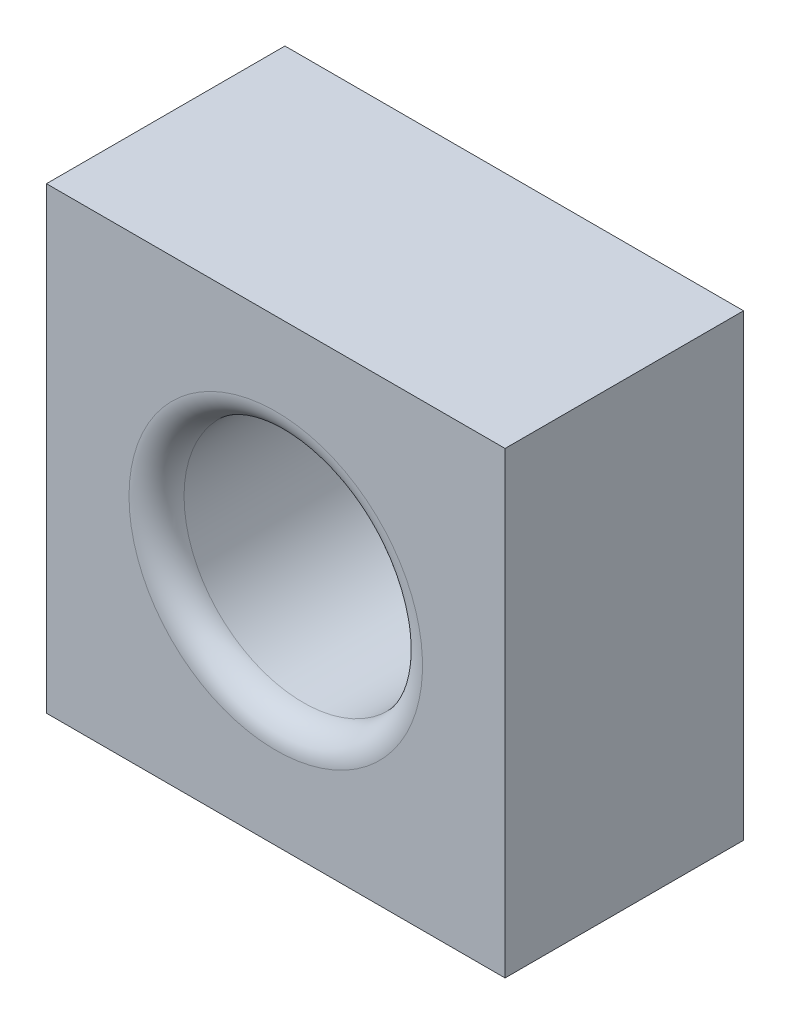
ISO-10303-21;
HEADER;
FILE_DESCRIPTION(('STEP AP214'),'2;1');
FILE_NAME('part.step','',(''),(''),'','','');
FILE_SCHEMA(('AUTOMOTIVE_DESIGN { 1 0 10303 214 1 1 1 1 }'));
ENDSEC;
DATA;
#1=APPLICATION_CONTEXT('core data for automotive mechanical design processes');
#2=APPLICATION_PROTOCOL_DEFINITION('international standard','automotive_design',2000,#1);
#3=PRODUCT_CONTEXT('',#1,'mechanical');
#4=PRODUCT('Part','Part','',(#3));
#5=PRODUCT_RELATED_PRODUCT_CATEGORY('part','',(#4));
#6=PRODUCT_DEFINITION_FORMATION('','',#4);
#7=PRODUCT_DEFINITION_CONTEXT('part definition',#1,'design');
#8=PRODUCT_DEFINITION('design','',#6,#7);
#9=PRODUCT_DEFINITION_SHAPE('','',#8);
#10=(LENGTH_UNIT() NAMED_UNIT(*) SI_UNIT(.MILLI.,.METRE.));
#11=(NAMED_UNIT(*) PLANE_ANGLE_UNIT() SI_UNIT($,.RADIAN.));
#12=(NAMED_UNIT(*) SI_UNIT($,.STERADIAN.) SOLID_ANGLE_UNIT());
#13=UNCERTAINTY_MEASURE_WITH_UNIT(LENGTH_MEASURE(1.E-05),#10,'distance_accuracy_value','');
#14=(GEOMETRIC_REPRESENTATION_CONTEXT(3) GLOBAL_UNCERTAINTY_ASSIGNED_CONTEXT((#13)) GLOBAL_UNIT_ASSIGNED_CONTEXT((#10,
#11,#12)) REPRESENTATION_CONTEXT('',''));
#15=CARTESIAN_POINT('',(0.,0.,0.));
#16=DIRECTION('',(0.,0.,1.));
#17=DIRECTION('',(1.,0.,0.));
#18=AXIS2_PLACEMENT_3D('',#15,#16,#17);
#19=CARTESIAN_POINT('',(0.,0.,13.));
#20=DIRECTION('',(0.,0.,-1.));
#21=DIRECTION('',(-1.,0.,0.));
#22=AXIS2_PLACEMENT_3D('',#19,#20,#21);
#23=PLANE('',#22);
#24=CARTESIAN_POINT('',(0.,0.,13.));
#25=DIRECTION('',(0.,0.,-1.));
#26=DIRECTION('',(-1.,0.,0.));
#27=AXIS2_PLACEMENT_3D('',#24,#25,#26);
#28=CIRCLE('',#27,8.);
#29=CARTESIAN_POINT('',(-8.,0.,13.));
#30=VERTEX_POINT('',#29);
#31=EDGE_CURVE('E11',#30,#30,#28,.T.);
#32=ORIENTED_EDGE('',*,*,#31,.T.);
#33=EDGE_LOOP('',(#32));
#34=FACE_BOUND('',#33,.T.);
#35=DIRECTION('',(0.,1.,0.));
#36=VECTOR('',#35,1.);
#37=CARTESIAN_POINT('',(12.5,-12.5,13.));
#38=LINE('',#37,#36);
#39=CARTESIAN_POINT('',(12.5,-12.5,13.));
#40=VERTEX_POINT('',#39);
#41=CARTESIAN_POINT('',(12.5,12.5,13.));
#42=VERTEX_POINT('',#41);
#43=EDGE_CURVE('E98',#40,#42,#38,.T.);
#44=ORIENTED_EDGE('',*,*,#43,.T.);
#45=DIRECTION('',(-1.,0.,0.));
#46=VECTOR('',#45,1.);
#47=CARTESIAN_POINT('',(-12.5,12.5,13.));
#48=LINE('',#47,#46);
#49=CARTESIAN_POINT('',(-12.5,12.5,13.));
#50=VERTEX_POINT('',#49);
#51=EDGE_CURVE('E94',#42,#50,#48,.T.);
#52=ORIENTED_EDGE('',*,*,#51,.T.);
#53=DIRECTION('',(0.,-1.,0.));
#54=VECTOR('',#53,1.);
#55=CARTESIAN_POINT('',(-12.5,-12.5,13.));
#56=LINE('',#55,#54);
#57=CARTESIAN_POINT('',(-12.5,-12.5,13.));
#58=VERTEX_POINT('',#57);
#59=EDGE_CURVE('E96',#50,#58,#56,.T.);
#60=ORIENTED_EDGE('',*,*,#59,.T.);
#61=DIRECTION('',(1.,0.,0.));
#62=VECTOR('',#61,1.);
#63=CARTESIAN_POINT('',(-12.5,-12.5,13.));
#64=LINE('',#63,#62);
#65=EDGE_CURVE('E63',#58,#40,#64,.T.);
#66=ORIENTED_EDGE('',*,*,#65,.T.);
#67=EDGE_LOOP('',(#44,#52,#60,#66));
#68=FACE_BOUND('',#67,.T.);
#69=ADVANCED_FACE('F45',(#34,#68),#23,.F.);
#70=CARTESIAN_POINT('',(0.,0.,0.));
#71=DIRECTION('',(0.,0.,-1.));
#72=DIRECTION('',(-1.,0.,0.));
#73=AXIS2_PLACEMENT_3D('',#70,#71,#72);
#74=PLANE('',#73);
#75=DIRECTION('',(0.,1.,0.));
#76=VECTOR('',#75,1.);
#77=CARTESIAN_POINT('',(12.5,-12.5,0.));
#78=LINE('',#77,#76);
#79=CARTESIAN_POINT('',(12.5,-12.5,0.));
#80=VERTEX_POINT('',#79);
#81=CARTESIAN_POINT('',(12.5,12.5,0.));
#82=VERTEX_POINT('',#81);
#83=EDGE_CURVE('E117',#80,#82,#78,.T.);
#84=ORIENTED_EDGE('',*,*,#83,.F.);
#85=DIRECTION('',(1.,0.,0.));
#86=VECTOR('',#85,1.);
#87=CARTESIAN_POINT('',(-12.5,-12.5,0.));
#88=LINE('',#87,#86);
#89=CARTESIAN_POINT('',(-12.5,-12.5,0.));
#90=VERTEX_POINT('',#89);
#91=EDGE_CURVE('E86',#90,#80,#88,.T.);
#92=ORIENTED_EDGE('',*,*,#91,.F.);
#93=DIRECTION('',(0.,-1.,0.));
#94=VECTOR('',#93,1.);
#95=CARTESIAN_POINT('',(-12.5,-12.5,0.));
#96=LINE('',#95,#94);
#97=CARTESIAN_POINT('',(-12.5,12.5,0.));
#98=VERTEX_POINT('',#97);
#99=EDGE_CURVE('E80',#98,#90,#96,.T.);
#100=ORIENTED_EDGE('',*,*,#99,.F.);
#101=DIRECTION('',(-1.,0.,0.));
#102=VECTOR('',#101,1.);
#103=CARTESIAN_POINT('',(-12.5,12.5,0.));
#104=LINE('',#103,#102);
#105=EDGE_CURVE('E104',#82,#98,#104,.T.);
#106=ORIENTED_EDGE('',*,*,#105,.F.);
#107=EDGE_LOOP('',(#84,#92,#100,#106));
#108=FACE_BOUND('',#107,.T.);
#109=CARTESIAN_POINT('',(0.,0.,0.));
#110=DIRECTION('',(0.,0.,1.));
#111=DIRECTION('',(1.,0.,0.));
#112=AXIS2_PLACEMENT_3D('',#109,#110,#111);
#113=CIRCLE('',#112,6.5);
#114=CARTESIAN_POINT('',(-6.5,0.,0.));
#115=VERTEX_POINT('',#114);
#116=EDGE_CURVE('E121',#115,#115,#113,.T.);
#117=ORIENTED_EDGE('',*,*,#116,.T.);
#118=EDGE_LOOP('',(#117));
#119=FACE_BOUND('',#118,.T.);
#120=ADVANCED_FACE('F149',(#108,#119),#74,.T.);
#121=CARTESIAN_POINT('',(12.5,-12.5,13.));
#122=DIRECTION('',(-1.,0.,0.));
#123=DIRECTION('',(0.,0.,1.));
#124=AXIS2_PLACEMENT_3D('',#121,#122,#123);
#125=PLANE('',#124);
#126=ORIENTED_EDGE('',*,*,#83,.T.);
#127=DIRECTION('',(0.,0.,-1.));
#128=VECTOR('',#127,1.);
#129=CARTESIAN_POINT('',(12.5,12.5,13.));
#130=LINE('',#129,#128);
#131=EDGE_CURVE('E106',#42,#82,#130,.T.);
#132=ORIENTED_EDGE('',*,*,#131,.F.);
#133=ORIENTED_EDGE('',*,*,#43,.F.);
#134=DIRECTION('',(0.,0.,-1.));
#135=VECTOR('',#134,1.);
#136=CARTESIAN_POINT('',(12.5,-12.5,13.));
#137=LINE('',#136,#135);
#138=EDGE_CURVE('E113',#40,#80,#137,.T.);
#139=ORIENTED_EDGE('',*,*,#138,.T.);
#140=EDGE_LOOP('',(#126,#132,#133,#139));
#141=FACE_BOUND('',#140,.T.);
#142=ADVANCED_FACE('F156',(#141),#125,.F.);
#143=CARTESIAN_POINT('',(-12.5,12.5,13.));
#144=DIRECTION('',(0.,-1.,0.));
#145=DIRECTION('',(0.,0.,-1.));
#146=AXIS2_PLACEMENT_3D('',#143,#144,#145);
#147=PLANE('',#146);
#148=ORIENTED_EDGE('',*,*,#105,.T.);
#149=DIRECTION('',(0.,0.,-1.));
#150=VECTOR('',#149,1.);
#151=CARTESIAN_POINT('',(-12.5,12.5,13.));
#152=LINE('',#151,#150);
#153=EDGE_CURVE('E102',#50,#98,#152,.T.);
#154=ORIENTED_EDGE('',*,*,#153,.F.);
#155=ORIENTED_EDGE('',*,*,#51,.F.);
#156=ORIENTED_EDGE('',*,*,#131,.T.);
#157=EDGE_LOOP('',(#148,#154,#155,#156));
#158=FACE_BOUND('',#157,.T.);
#159=ADVANCED_FACE('F103',(#158),#147,.F.);
#160=CARTESIAN_POINT('',(-12.5,-12.5,13.));
#161=DIRECTION('',(1.,0.,0.));
#162=DIRECTION('',(0.,0.,-1.));
#163=AXIS2_PLACEMENT_3D('',#160,#161,#162);
#164=PLANE('',#163);
#165=ORIENTED_EDGE('',*,*,#99,.T.);
#166=DIRECTION('',(0.,0.,-1.));
#167=VECTOR('',#166,1.);
#168=CARTESIAN_POINT('',(-12.5,-12.5,13.));
#169=LINE('',#168,#167);
#170=EDGE_CURVE('E107',#58,#90,#169,.T.);
#171=ORIENTED_EDGE('',*,*,#170,.F.);
#172=ORIENTED_EDGE('',*,*,#59,.F.);
#173=ORIENTED_EDGE('',*,*,#153,.T.);
#174=EDGE_LOOP('',(#165,#171,#172,#173));
#175=FACE_BOUND('',#174,.T.);
#176=ADVANCED_FACE('F109',(#175),#164,.F.);
#177=CARTESIAN_POINT('',(-12.5,-12.5,13.));
#178=DIRECTION('',(0.,1.,0.));
#179=DIRECTION('',(0.,0.,1.));
#180=AXIS2_PLACEMENT_3D('',#177,#178,#179);
#181=PLANE('',#180);
#182=ORIENTED_EDGE('',*,*,#91,.T.);
#183=ORIENTED_EDGE('',*,*,#138,.F.);
#184=ORIENTED_EDGE('',*,*,#65,.F.);
#185=ORIENTED_EDGE('',*,*,#170,.T.);
#186=EDGE_LOOP('',(#182,#183,#184,#185));
#187=FACE_BOUND('',#186,.T.);
#188=ADVANCED_FACE('F145',(#187),#181,.F.);
#189=CARTESIAN_POINT('',(0.,0.,13.));
#190=DIRECTION('',(0.,0.,-1.));
#191=DIRECTION('',(-1.,0.,0.));
#192=AXIS2_PLACEMENT_3D('',#189,#190,#191);
#193=CYLINDRICAL_SURFACE('',#192,6.5);
#194=CARTESIAN_POINT('',(0.,0.,11.5));
#195=DIRECTION('',(0.,0.,-1.));
#196=DIRECTION('',(-1.,0.,0.));
#197=AXIS2_PLACEMENT_3D('',#194,#195,#196);
#198=CIRCLE('',#197,6.5);
#199=CARTESIAN_POINT('',(-6.5,0.,11.5));
#200=VERTEX_POINT('',#199);
#201=EDGE_CURVE('E55',#200,#200,#198,.F.);
#202=CARTESIAN_POINT('',(-6.5,0.,11.5));
#203=CARTESIAN_POINT('',(-6.5,0.,11.3802083333333));
#204=CARTESIAN_POINT('',(-6.5,0.,11.2604166666667));
#205=CARTESIAN_POINT('',(-6.5,0.,11.0208333333333));
#206=CARTESIAN_POINT('',(-6.5,0.,10.9010416666667));
#207=CARTESIAN_POINT('',(-6.5,0.,10.6614583333333));
#208=CARTESIAN_POINT('',(-6.5,0.,10.5416666666667));
#209=CARTESIAN_POINT('',(-6.5,0.,10.3020833333333));
#210=CARTESIAN_POINT('',(-6.5,0.,10.1822916666667));
#211=CARTESIAN_POINT('',(-6.5,0.,9.94270833333333));
#212=CARTESIAN_POINT('',(-6.5,0.,9.82291666666667));
#213=CARTESIAN_POINT('',(-6.5,0.,9.58333333333333));
#214=CARTESIAN_POINT('',(-6.5,0.,9.46354166666667));
#215=CARTESIAN_POINT('',(-6.5,0.,9.22395833333333));
#216=CARTESIAN_POINT('',(-6.5,0.,9.10416666666667));
#217=CARTESIAN_POINT('',(-6.5,0.,8.86458333333333));
#218=CARTESIAN_POINT('',(-6.5,0.,8.74479166666667));
#219=CARTESIAN_POINT('',(-6.5,0.,8.50520833333333));
#220=CARTESIAN_POINT('',(-6.5,0.,8.38541666666667));
#221=CARTESIAN_POINT('',(-6.5,0.,8.14583333333333));
#222=CARTESIAN_POINT('',(-6.5,0.,8.02604166666667));
#223=CARTESIAN_POINT('',(-6.5,0.,7.78645833333333));
#224=CARTESIAN_POINT('',(-6.5,0.,7.66666666666667));
#225=CARTESIAN_POINT('',(-6.5,0.,7.42708333333333));
#226=CARTESIAN_POINT('',(-6.5,0.,7.30729166666667));
#227=CARTESIAN_POINT('',(-6.5,0.,7.06770833333333));
#228=CARTESIAN_POINT('',(-6.5,0.,6.94791666666667));
#229=CARTESIAN_POINT('',(-6.5,0.,6.70833333333333));
#230=CARTESIAN_POINT('',(-6.5,0.,6.58854166666667));
#231=CARTESIAN_POINT('',(-6.5,0.,6.34895833333333));
#232=CARTESIAN_POINT('',(-6.5,0.,6.22916666666667));
#233=CARTESIAN_POINT('',(-6.5,0.,5.98958333333333));
#234=CARTESIAN_POINT('',(-6.5,0.,5.86979166666667));
#235=CARTESIAN_POINT('',(-6.5,0.,5.63020833333333));
#236=CARTESIAN_POINT('',(-6.5,0.,5.51041666666667));
#237=CARTESIAN_POINT('',(-6.5,0.,5.27083333333333));
#238=CARTESIAN_POINT('',(-6.5,0.,5.15104166666667));
#239=CARTESIAN_POINT('',(-6.5,0.,4.91145833333333));
#240=CARTESIAN_POINT('',(-6.5,0.,4.79166666666667));
#241=CARTESIAN_POINT('',(-6.5,0.,4.55208333333333));
#242=CARTESIAN_POINT('',(-6.5,0.,4.43229166666667));
#243=CARTESIAN_POINT('',(-6.5,0.,4.19270833333333));
#244=CARTESIAN_POINT('',(-6.5,0.,4.07291666666667));
#245=CARTESIAN_POINT('',(-6.5,0.,3.83333333333333));
#246=CARTESIAN_POINT('',(-6.5,0.,3.71354166666667));
#247=CARTESIAN_POINT('',(-6.5,0.,3.47395833333333));
#248=CARTESIAN_POINT('',(-6.5,0.,3.35416666666667));
#249=CARTESIAN_POINT('',(-6.5,0.,3.11458333333333));
#250=CARTESIAN_POINT('',(-6.5,0.,2.99479166666667));
#251=CARTESIAN_POINT('',(-6.5,0.,2.75520833333333));
#252=CARTESIAN_POINT('',(-6.5,0.,2.63541666666667));
#253=CARTESIAN_POINT('',(-6.5,0.,2.39583333333333));
#254=CARTESIAN_POINT('',(-6.5,0.,2.27604166666667));
#255=CARTESIAN_POINT('',(-6.5,0.,2.03645833333333));
#256=CARTESIAN_POINT('',(-6.5,0.,1.91666666666667));
#257=CARTESIAN_POINT('',(-6.5,0.,1.67708333333333));
#258=CARTESIAN_POINT('',(-6.5,0.,1.55729166666667));
#259=CARTESIAN_POINT('',(-6.5,0.,1.31770833333333));
#260=CARTESIAN_POINT('',(-6.5,0.,1.19791666666667));
#261=CARTESIAN_POINT('',(-6.5,0.,0.958333333333333));
#262=CARTESIAN_POINT('',(-6.5,0.,0.838541666666667));
#263=CARTESIAN_POINT('',(-6.5,0.,0.598958333333333));
#264=CARTESIAN_POINT('',(-6.5,0.,0.479166666666666));
#265=CARTESIAN_POINT('',(-6.5,0.,0.239583333333332));
#266=CARTESIAN_POINT('',(-6.5,0.,0.119791666666666));
#267=CARTESIAN_POINT('',(-6.5,0.,0.));
#268=B_SPLINE_CURVE_WITH_KNOTS('',3,(#202,#203,#204,#205,#206,#207,#208,#209,#210,#211,#212,
#213,#214,#215,#216,#217,#218,#219,#220,#221,#222,#223,#224,#225,#226,#227,#228,#229,#230,#231,
#232,#233,#234,#235,#236,#237,#238,#239,#240,#241,#242,#243,#244,#245,#246,#247,#248,#249,#250,
#251,#252,#253,#254,#255,#256,#257,#258,#259,#260,#261,#262,#263,#264,#265,#266,#267),
.UNSPECIFIED.,.F.,.F.,(4,2,2,2,2,2,2,2,2,2,2,2,2,2,2,2,2,2,2,2,2,2,2,2,2,2,2,2,2,2,2,2,4),(0.,
0.359375,0.718750000000001,1.078125,1.4375,1.796875,2.15625,2.515625,2.875,3.234375,3.59375,
3.953125,4.3125,4.671875,5.03125,5.390625,5.75,6.109375,6.46875,6.828125,7.1875,7.546875,
7.90625,8.265625,8.625,8.984375,9.34375,9.703125,10.0625,10.421875,10.78125,11.140625,11.5),.UNSPECIFIED.);
#269=EDGE_CURVE('BSEAM137',#200,#115,#268,.T.);
#270=ORIENTED_EDGE('',*,*,#201,.T.);
#271=ORIENTED_EDGE('',*,*,#116,.F.);
#272=ORIENTED_EDGE('',*,*,#269,.T.);
#273=ORIENTED_EDGE('',*,*,#269,.F.);
#274=EDGE_LOOP('',(#270,#272,#271,#273));
#275=FACE_BOUND('',#274,.T.);
#276=ADVANCED_FACE('F137',(#275),#193,.F.);
#277=CARTESIAN_POINT('',(0.,0.,11.5));
#278=DIRECTION('',(0.,0.,-1.));
#279=DIRECTION('',(-1.,0.,0.));
#280=AXIS2_PLACEMENT_3D('',#277,#278,#279);
#281=TOROIDAL_SURFACE('',#280,8.,1.5);
#282=ORIENTED_EDGE('',*,*,#31,.F.);
#283=EDGE_LOOP('',(#282));
#284=FACE_BOUND('',#283,.T.);
#285=ORIENTED_EDGE('',*,*,#201,.F.);
#286=EDGE_LOOP('',(#285));
#287=FACE_BOUND('',#286,.T.);
#288=ADVANCED_FACE('F47',(#284,#287),#281,.T.);
#289=CLOSED_SHELL('',(#69,#120,#142,#159,#176,#188,#276,#288));
#290=MANIFOLD_SOLID_BREP('B2',#289);
#291=ADVANCED_BREP_SHAPE_REPRESENTATION('',(#18,#290),#14);
#292=SHAPE_DEFINITION_REPRESENTATION(#9,#291);
ENDSEC;
END-ISO-10303-21;
